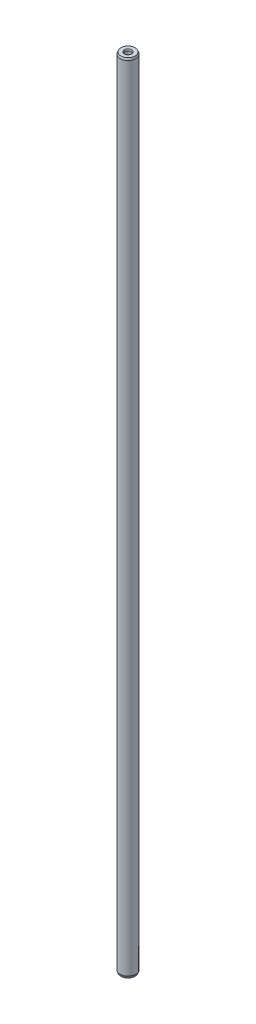
ISO-10303-21;
HEADER;
FILE_DESCRIPTION(('STEP AP214'),'2;1');
FILE_NAME('part.step','',(''),(''),'','','');
FILE_SCHEMA(('AUTOMOTIVE_DESIGN { 1 0 10303 214 1 1 1 1 }'));
ENDSEC;
DATA;
#1=APPLICATION_CONTEXT('core data for automotive mechanical design processes');
#2=APPLICATION_PROTOCOL_DEFINITION('international standard','automotive_design',2000,#1);
#3=PRODUCT_CONTEXT('',#1,'mechanical');
#4=PRODUCT('Part','Part','',(#3));
#5=PRODUCT_RELATED_PRODUCT_CATEGORY('part','',(#4));
#6=PRODUCT_DEFINITION_FORMATION('','',#4);
#7=PRODUCT_DEFINITION_CONTEXT('part definition',#1,'design');
#8=PRODUCT_DEFINITION('design','',#6,#7);
#9=PRODUCT_DEFINITION_SHAPE('','',#8);
#10=(LENGTH_UNIT() NAMED_UNIT(*) SI_UNIT(.MILLI.,.METRE.));
#11=(NAMED_UNIT(*) PLANE_ANGLE_UNIT() SI_UNIT($,.RADIAN.));
#12=(NAMED_UNIT(*) SI_UNIT($,.STERADIAN.) SOLID_ANGLE_UNIT());
#13=UNCERTAINTY_MEASURE_WITH_UNIT(LENGTH_MEASURE(1.E-05),#10,'distance_accuracy_value','');
#14=(GEOMETRIC_REPRESENTATION_CONTEXT(3) GLOBAL_UNCERTAINTY_ASSIGNED_CONTEXT((#13)) GLOBAL_UNIT_ASSIGNED_CONTEXT((#10,
#11,#12)) REPRESENTATION_CONTEXT('',''));
#15=CARTESIAN_POINT('',(0.,0.,0.));
#16=DIRECTION('',(0.,0.,1.));
#17=DIRECTION('',(1.,0.,0.));
#18=AXIS2_PLACEMENT_3D('',#15,#16,#17);
#19=CARTESIAN_POINT('',(-1.06592274227144,-149.914063069389,-1.12643595849704));
#20=DIRECTION('',(0.,1.,0.));
#21=DIRECTION('',(0.,0.,1.));
#22=AXIS2_PLACEMENT_3D('',#19,#20,#21);
#23=CYLINDRICAL_SURFACE('',#22,1.1303);
#24=CARTESIAN_POINT('',(-1.06592274227144,-144.1990630693,-1.12643595849704));
#25=DIRECTION('',(0.,1.,0.));
#26=DIRECTION('',(0.,0.,1.));
#27=AXIS2_PLACEMENT_3D('',#24,#25,#26);
#28=CIRCLE('',#27,1.1303);
#29=CARTESIAN_POINT('',(-1.06592274227144,-144.1990630693,0.00386404150295788));
#30=VERTEX_POINT('',#29);
#31=EDGE_CURVE('E11',#30,#30,#28,.T.);
#32=ORIENTED_EDGE('',*,*,#31,.T.);
#33=EDGE_LOOP('',(#32));
#34=FACE_BOUND('',#33,.T.);
#35=CARTESIAN_POINT('',(-1.06592274227144,-149.474122164236,-1.12643595849704));
#36=DIRECTION('',(0.,1.,0.));
#37=DIRECTION('',(0.,0.,1.));
#38=AXIS2_PLACEMENT_3D('',#35,#36,#37);
#39=CIRCLE('',#38,1.1303);
#40=CARTESIAN_POINT('',(-1.06592274227144,-149.474122164236,0.00386404150295788));
#41=VERTEX_POINT('',#40);
#42=EDGE_CURVE('E57',#41,#41,#39,.T.);
#43=ORIENTED_EDGE('',*,*,#42,.F.);
#44=EDGE_LOOP('',(#43));
#45=FACE_BOUND('',#44,.T.);
#46=ADVANCED_FACE('F34',(#34,#45),#23,.F.);
#47=CARTESIAN_POINT('',(-1.06592274227144,-144.1990630693,-1.12643595849704));
#48=DIRECTION('',(0.,-1.,0.));
#49=DIRECTION('',(0.,0.,-1.));
#50=AXIS2_PLACEMENT_3D('',#47,#48,#49);
#51=CONICAL_SURFACE('',#50,1.1303,1.02974425868413);
#52=CARTESIAN_POINT('',(-1.06592274227144,-143.519910311625,-1.12643595849704));
#53=VERTEX_POINT('',#52);
#54=VERTEX_LOOP('',#53);
#55=FACE_BOUND('',#54,.T.);
#56=ORIENTED_EDGE('',*,*,#31,.F.);
#57=EDGE_LOOP('',(#56));
#58=FACE_BOUND('',#57,.T.);
#59=ADVANCED_FACE('F47',(#55,#58),#51,.F.);
#60=CARTESIAN_POINT('',(-1.06592274227144,148.491784172927,-1.12643595849704));
#61=DIRECTION('',(0.,1.,0.));
#62=DIRECTION('',(0.,0.,1.));
#63=AXIS2_PLACEMENT_3D('',#60,#61,#62);
#64=CONICAL_SURFACE('',#63,0.,1.02974425861021);
#65=CARTESIAN_POINT('',(-1.06592274227144,149.170936930716,-1.12643595849704));
#66=DIRECTION('',(0.,1.,0.));
#67=DIRECTION('',(0.,0.,1.));
#68=AXIS2_PLACEMENT_3D('',#65,#66,#67);
#69=CIRCLE('',#68,1.1303);
#70=CARTESIAN_POINT('',(-1.06592274227144,149.170936930716,0.00386404150295788));
#71=VERTEX_POINT('',#70);
#72=EDGE_CURVE('E41',#71,#71,#69,.T.);
#73=ORIENTED_EDGE('',*,*,#72,.T.);
#74=EDGE_LOOP('',(#73));
#75=FACE_BOUND('',#74,.T.);
#76=CARTESIAN_POINT('',(-1.06592274227144,148.491784172927,-1.12643595849704));
#77=VERTEX_POINT('',#76);
#78=VERTEX_LOOP('',#77);
#79=FACE_BOUND('',#78,.T.);
#80=ADVANCED_FACE('F50',(#75,#79),#64,.F.);
#81=CARTESIAN_POINT('',(-1.06592274227144,-149.914063069389,-1.12643595849704));
#82=DIRECTION('',(0.,1.,0.));
#83=DIRECTION('',(0.,0.,1.));
#84=AXIS2_PLACEMENT_3D('',#81,#82,#83);
#85=CYLINDRICAL_SURFACE('',#84,1.1303);
#86=CARTESIAN_POINT('',(-1.06592274227144,154.445996025515,-1.12643595849704));
#87=DIRECTION('',(0.,1.,0.));
#88=DIRECTION('',(0.,0.,1.));
#89=AXIS2_PLACEMENT_3D('',#86,#87,#88);
#90=CIRCLE('',#89,1.1303);
#91=CARTESIAN_POINT('',(-1.06592274227144,154.445996025515,0.00386404150295788));
#92=VERTEX_POINT('',#91);
#93=EDGE_CURVE('E79',#92,#92,#90,.T.);
#94=ORIENTED_EDGE('',*,*,#93,.T.);
#95=EDGE_LOOP('',(#94));
#96=FACE_BOUND('',#95,.T.);
#97=ORIENTED_EDGE('',*,*,#72,.F.);
#98=EDGE_LOOP('',(#97));
#99=FACE_BOUND('',#98,.T.);
#100=ADVANCED_FACE('F85',(#96,#99),#85,.F.);
#101=CARTESIAN_POINT('',(-1.06592274227144,154.445996025515,-1.12643595849704));
#102=DIRECTION('',(0.,1.,0.));
#103=DIRECTION('',(0.,0.,1.));
#104=AXIS2_PLACEMENT_3D('',#101,#102,#103);
#105=CONICAL_SURFACE('',#104,1.1303,0.523598775485735);
#106=CARTESIAN_POINT('',(-1.06592274227144,154.885936930725,-1.12643595849704));
#107=DIRECTION('',(0.,1.,0.));
#108=DIRECTION('',(0.,0.,1.));
#109=AXIS2_PLACEMENT_3D('',#106,#107,#108);
#110=CIRCLE('',#109,1.38429999998458);
#111=CARTESIAN_POINT('',(-1.06592274227144,154.885936930725,0.257864041487541));
#112=VERTEX_POINT('',#111);
#113=EDGE_CURVE('E76',#112,#112,#110,.T.);
#114=ORIENTED_EDGE('',*,*,#113,.T.);
#115=EDGE_LOOP('',(#114));
#116=FACE_BOUND('',#115,.T.);
#117=ORIENTED_EDGE('',*,*,#93,.F.);
#118=EDGE_LOOP('',(#117));
#119=FACE_BOUND('',#118,.T.);
#120=ADVANCED_FACE('F87',(#116,#119),#105,.F.);
#121=CARTESIAN_POINT('',(0.318377257713142,154.885936930725,-1.12643595849704));
#122=DIRECTION('',(0.,1.,0.));
#123=DIRECTION('',(0.,0.,1.));
#124=AXIS2_PLACEMENT_3D('',#121,#122,#123);
#125=PLANE('',#124);
#126=CARTESIAN_POINT('',(-1.06592274227144,154.885936930725,-1.12643595849704));
#127=DIRECTION('',(0.,1.,0.));
#128=DIRECTION('',(0.,0.,1.));
#129=AXIS2_PLACEMENT_3D('',#126,#127,#128);
#130=CIRCLE('',#129,2.7431999999984);
#131=CARTESIAN_POINT('',(-1.06592274227144,154.885936930725,1.61676404150136));
#132=VERTEX_POINT('',#131);
#133=EDGE_CURVE('E73',#132,#132,#130,.T.);
#134=ORIENTED_EDGE('',*,*,#133,.T.);
#135=EDGE_LOOP('',(#134));
#136=FACE_BOUND('',#135,.T.);
#137=ORIENTED_EDGE('',*,*,#113,.F.);
#138=EDGE_LOOP('',(#137));
#139=FACE_BOUND('',#138,.T.);
#140=ADVANCED_FACE('F94',(#136,#139),#125,.T.);
#141=CARTESIAN_POINT('',(-1.06592274227144,154.885936930725,-1.12643595849704));
#142=DIRECTION('',(0.,-1.,0.));
#143=DIRECTION('',(0.,0.,-1.));
#144=AXIS2_PLACEMENT_3D('',#141,#142,#143);
#145=CONICAL_SURFACE('',#144,2.7431999999984,0.321750554399427);
#146=CARTESIAN_POINT('',(-1.06592274227144,154.123936930725,-1.12643595849704));
#147=DIRECTION('',(0.,1.,0.));
#148=DIRECTION('',(0.,0.,1.));
#149=AXIS2_PLACEMENT_3D('',#146,#147,#148);
#150=CIRCLE('',#149,2.99720000000079);
#151=CARTESIAN_POINT('',(-1.06592274227144,154.123936930725,1.87076404150374));
#152=VERTEX_POINT('',#151);
#153=EDGE_CURVE('E70',#152,#152,#150,.T.);
#154=ORIENTED_EDGE('',*,*,#153,.T.);
#155=EDGE_LOOP('',(#154));
#156=FACE_BOUND('',#155,.T.);
#157=ORIENTED_EDGE('',*,*,#133,.F.);
#158=EDGE_LOOP('',(#157));
#159=FACE_BOUND('',#158,.T.);
#160=ADVANCED_FACE('F101',(#156,#159),#145,.T.);
#161=CARTESIAN_POINT('',(-1.06592274227144,-149.914063069389,-1.12643595849704));
#162=DIRECTION('',(0.,1.,0.));
#163=DIRECTION('',(0.,0.,1.));
#164=AXIS2_PLACEMENT_3D('',#161,#162,#163);
#165=CYLINDRICAL_SURFACE('',#164,2.99720000000079);
#166=CARTESIAN_POINT('',(-1.06592274227144,-149.152063069275,-1.12643595849704));
#167=DIRECTION('',(0.,1.,0.));
#168=DIRECTION('',(0.,0.,1.));
#169=AXIS2_PLACEMENT_3D('',#166,#167,#168);
#170=CIRCLE('',#169,2.99720000000079);
#171=CARTESIAN_POINT('',(-1.06592274227144,-149.152063069275,1.87076404150374));
#172=VERTEX_POINT('',#171);
#173=EDGE_CURVE('E67',#172,#172,#170,.T.);
#174=ORIENTED_EDGE('',*,*,#173,.T.);
#175=EDGE_LOOP('',(#174));
#176=FACE_BOUND('',#175,.T.);
#177=ORIENTED_EDGE('',*,*,#153,.F.);
#178=EDGE_LOOP('',(#177));
#179=FACE_BOUND('',#178,.T.);
#180=ADVANCED_FACE('F105',(#176,#179),#165,.T.);
#181=CARTESIAN_POINT('',(-1.06592274227144,-149.152063069275,-1.12643595849704));
#182=DIRECTION('',(0.,1.,0.));
#183=DIRECTION('',(0.,0.,1.));
#184=AXIS2_PLACEMENT_3D('',#181,#182,#183);
#185=CONICAL_SURFACE('',#184,2.99720000000079,0.321750554343511);
#186=CARTESIAN_POINT('',(-1.06592274227144,-149.914063069332,-1.12643595849704));
#187=DIRECTION('',(0.,1.,0.));
#188=DIRECTION('',(0.,0.,1.));
#189=AXIS2_PLACEMENT_3D('',#186,#187,#188);
#190=CIRCLE('',#189,2.74320000002682);
#191=CARTESIAN_POINT('',(-1.06592274227144,-149.914063069332,1.61676404152978));
#192=VERTEX_POINT('',#191);
#193=EDGE_CURVE('E62',#192,#192,#190,.T.);
#194=ORIENTED_EDGE('',*,*,#193,.T.);
#195=EDGE_LOOP('',(#194));
#196=FACE_BOUND('',#195,.T.);
#197=ORIENTED_EDGE('',*,*,#173,.F.);
#198=EDGE_LOOP('',(#197));
#199=FACE_BOUND('',#198,.T.);
#200=ADVANCED_FACE('F109',(#196,#199),#185,.T.);
#201=CARTESIAN_POINT('',(1.67727725775538,-149.914063069332,-1.12643595849704));
#202=DIRECTION('',(0.,-1.,0.));
#203=DIRECTION('',(0.,0.,-1.));
#204=AXIS2_PLACEMENT_3D('',#201,#202,#203);
#205=PLANE('',#204);
#206=CARTESIAN_POINT('',(-1.06592274227144,-149.914063069332,-1.12643595849704));
#207=DIRECTION('',(0.,1.,0.));
#208=DIRECTION('',(0.,0.,1.));
#209=AXIS2_PLACEMENT_3D('',#206,#207,#208);
#210=CIRCLE('',#209,1.38429999998458);
#211=CARTESIAN_POINT('',(-1.06592274227144,-149.914063069332,0.257864041487541));
#212=VERTEX_POINT('',#211);
#213=EDGE_CURVE('E59',#212,#212,#210,.T.);
#214=ORIENTED_EDGE('',*,*,#213,.T.);
#215=EDGE_LOOP('',(#214));
#216=FACE_BOUND('',#215,.T.);
#217=ORIENTED_EDGE('',*,*,#193,.F.);
#218=EDGE_LOOP('',(#217));
#219=FACE_BOUND('',#218,.T.);
#220=ADVANCED_FACE('F113',(#216,#219),#205,.T.);
#221=CARTESIAN_POINT('',(-1.06592274227144,-149.914063069332,-1.12643595849704));
#222=DIRECTION('',(0.,-1.,0.));
#223=DIRECTION('',(0.,0.,-1.));
#224=AXIS2_PLACEMENT_3D('',#221,#222,#223);
#225=CONICAL_SURFACE('',#224,1.38429999998458,0.523598775598287);
#226=ORIENTED_EDGE('',*,*,#42,.T.);
#227=EDGE_LOOP('',(#226));
#228=FACE_BOUND('',#227,.T.);
#229=ORIENTED_EDGE('',*,*,#213,.F.);
#230=EDGE_LOOP('',(#229));
#231=FACE_BOUND('',#230,.T.);
#232=ADVANCED_FACE('F117',(#228,#231),#225,.F.);
#233=CLOSED_SHELL('',(#46,#59,#80,#100,#120,#140,#160,#180,#200,#220,#232));
#234=MANIFOLD_SOLID_BREP('B2',#233);
#235=ADVANCED_BREP_SHAPE_REPRESENTATION('',(#18,#234),#14);
#236=SHAPE_DEFINITION_REPRESENTATION(#9,#235);
ENDSEC;
END-ISO-10303-21;
